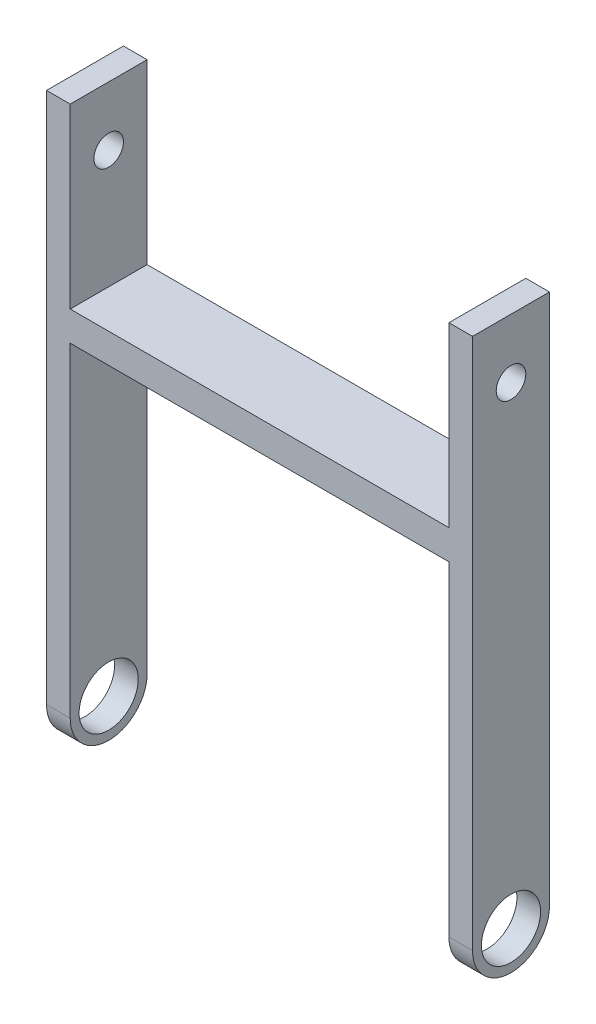
ISO-10303-21;
HEADER;
FILE_DESCRIPTION(('STEP AP214'),'2;1');
FILE_NAME('part.step','',(''),(''),'','','');
FILE_SCHEMA(('AUTOMOTIVE_DESIGN { 1 0 10303 214 1 1 1 1 }'));
ENDSEC;
DATA;
#1=APPLICATION_CONTEXT('core data for automotive mechanical design processes');
#2=APPLICATION_PROTOCOL_DEFINITION('international standard','automotive_design',2000,#1);
#3=PRODUCT_CONTEXT('',#1,'mechanical');
#4=PRODUCT('Part','Part','',(#3));
#5=PRODUCT_RELATED_PRODUCT_CATEGORY('part','',(#4));
#6=PRODUCT_DEFINITION_FORMATION('','',#4);
#7=PRODUCT_DEFINITION_CONTEXT('part definition',#1,'design');
#8=PRODUCT_DEFINITION('design','',#6,#7);
#9=PRODUCT_DEFINITION_SHAPE('','',#8);
#10=(LENGTH_UNIT() NAMED_UNIT(*) SI_UNIT(.MILLI.,.METRE.));
#11=(NAMED_UNIT(*) PLANE_ANGLE_UNIT() SI_UNIT($,.RADIAN.));
#12=(NAMED_UNIT(*) SI_UNIT($,.STERADIAN.) SOLID_ANGLE_UNIT());
#13=UNCERTAINTY_MEASURE_WITH_UNIT(LENGTH_MEASURE(1.E-05),#10,'distance_accuracy_value','');
#14=(GEOMETRIC_REPRESENTATION_CONTEXT(3) GLOBAL_UNCERTAINTY_ASSIGNED_CONTEXT((#13)) GLOBAL_UNIT_ASSIGNED_CONTEXT((#10,
#11,#12)) REPRESENTATION_CONTEXT('',''));
#15=CARTESIAN_POINT('',(0.,0.,0.));
#16=DIRECTION('',(0.,0.,1.));
#17=DIRECTION('',(1.,0.,0.));
#18=AXIS2_PLACEMENT_3D('',#15,#16,#17);
#19=CARTESIAN_POINT('',(3.99999999999999,65.,13.));
#20=DIRECTION('',(-1.,0.,0.));
#21=DIRECTION('',(0.,-1.,0.));
#22=AXIS2_PLACEMENT_3D('',#19,#20,#21);
#23=PLANE('',#22);
#24=CARTESIAN_POINT('',(4.,10.1,6.5));
#25=DIRECTION('',(-1.,0.,0.));
#26=DIRECTION('',(0.,-1.,0.));
#27=AXIS2_PLACEMENT_3D('',#24,#25,#26);
#28=CIRCLE('',#27,5.);
#29=CARTESIAN_POINT('',(4.,5.10000000000001,6.5));
#30=VERTEX_POINT('',#29);
#31=EDGE_CURVE('E195',#30,#30,#28,.T.);
#32=ORIENTED_EDGE('',*,*,#31,.T.);
#33=EDGE_LOOP('',(#32));
#34=FACE_BOUND('',#33,.T.);
#35=DIRECTION('',(0.,1.,0.));
#36=VECTOR('',#35,1.);
#37=CARTESIAN_POINT('',(3.99999999999999,65.,13.));
#38=LINE('',#37,#36);
#39=CARTESIAN_POINT('',(4.,10.1,13.));
#40=VERTEX_POINT('',#39);
#41=CARTESIAN_POINT('',(3.99999999999999,65.,13.));
#42=VERTEX_POINT('',#41);
#43=EDGE_CURVE('E162',#40,#42,#38,.T.);
#44=ORIENTED_EDGE('',*,*,#43,.F.);
#45=CARTESIAN_POINT('',(3.99999999999999,10.1,6.5));
#46=DIRECTION('',(-1.,0.,0.));
#47=DIRECTION('',(0.,-1.,0.));
#48=AXIS2_PLACEMENT_3D('',#45,#46,#47);
#49=CIRCLE('',#48,6.5);
#50=CARTESIAN_POINT('',(4.,10.1,0.));
#51=VERTEX_POINT('',#50);
#52=EDGE_CURVE('E237',#40,#51,#49,.F.);
#53=ORIENTED_EDGE('',*,*,#52,.T.);
#54=DIRECTION('',(0.,1.,0.));
#55=VECTOR('',#54,1.);
#56=CARTESIAN_POINT('',(3.99999999999999,65.,0.));
#57=LINE('',#56,#55);
#58=CARTESIAN_POINT('',(3.99999999999999,65.,0.));
#59=VERTEX_POINT('',#58);
#60=EDGE_CURVE('E194',#51,#59,#57,.T.);
#61=ORIENTED_EDGE('',*,*,#60,.T.);
#62=DIRECTION('',(0.,0.,-1.));
#63=VECTOR('',#62,1.);
#64=CARTESIAN_POINT('',(3.99999999999999,65.,13.));
#65=LINE('',#64,#63);
#66=EDGE_CURVE('E44',#42,#59,#65,.T.);
#67=ORIENTED_EDGE('',*,*,#66,.F.);
#68=EDGE_LOOP('',(#44,#53,#61,#67));
#69=FACE_BOUND('',#68,.T.);
#70=ADVANCED_FACE('F37',(#34,#69),#23,.F.);
#71=CARTESIAN_POINT('',(68.,65.,13.));
#72=DIRECTION('',(0.,1.,0.));
#73=DIRECTION('',(-1.,0.,0.));
#74=AXIS2_PLACEMENT_3D('',#71,#72,#73);
#75=PLANE('',#74);
#76=DIRECTION('',(1.,0.,0.));
#77=VECTOR('',#76,1.);
#78=CARTESIAN_POINT('',(68.,65.,0.));
#79=LINE('',#78,#77);
#80=CARTESIAN_POINT('',(68.,65.,0.));
#81=VERTEX_POINT('',#80);
#82=EDGE_CURVE('E148',#59,#81,#79,.T.);
#83=ORIENTED_EDGE('',*,*,#82,.T.);
#84=DIRECTION('',(0.,0.,-1.));
#85=VECTOR('',#84,1.);
#86=CARTESIAN_POINT('',(68.,65.,13.));
#87=LINE('',#86,#85);
#88=CARTESIAN_POINT('',(68.,65.,13.));
#89=VERTEX_POINT('',#88);
#90=EDGE_CURVE('E181',#89,#81,#87,.T.);
#91=ORIENTED_EDGE('',*,*,#90,.F.);
#92=DIRECTION('',(1.,0.,0.));
#93=VECTOR('',#92,1.);
#94=CARTESIAN_POINT('',(68.,65.,13.));
#95=LINE('',#94,#93);
#96=EDGE_CURVE('E190',#42,#89,#95,.T.);
#97=ORIENTED_EDGE('',*,*,#96,.F.);
#98=ORIENTED_EDGE('',*,*,#66,.T.);
#99=EDGE_LOOP('',(#83,#91,#97,#98));
#100=FACE_BOUND('',#99,.T.);
#101=ADVANCED_FACE('F188',(#100),#75,.F.);
#102=CARTESIAN_POINT('',(68.,0.,13.));
#103=DIRECTION('',(1.,0.,0.));
#104=DIRECTION('',(0.,0.,-1.));
#105=AXIS2_PLACEMENT_3D('',#102,#103,#104);
#106=PLANE('',#105);
#107=CARTESIAN_POINT('',(68.,10.1,6.5));
#108=DIRECTION('',(1.,0.,0.));
#109=DIRECTION('',(0.,0.,-1.));
#110=AXIS2_PLACEMENT_3D('',#107,#108,#109);
#111=CIRCLE('',#110,5.);
#112=CARTESIAN_POINT('',(68.,10.1,1.5));
#113=VERTEX_POINT('',#112);
#114=EDGE_CURVE('E218',#113,#113,#111,.T.);
#115=ORIENTED_EDGE('',*,*,#114,.T.);
#116=EDGE_LOOP('',(#115));
#117=FACE_BOUND('',#116,.T.);
#118=DIRECTION('',(0.,-1.,0.));
#119=VECTOR('',#118,1.);
#120=CARTESIAN_POINT('',(68.,0.,0.));
#121=LINE('',#120,#119);
#122=CARTESIAN_POINT('',(68.,10.1,0.));
#123=VERTEX_POINT('',#122);
#124=EDGE_CURVE('E144',#81,#123,#121,.T.);
#125=ORIENTED_EDGE('',*,*,#124,.T.);
#126=CARTESIAN_POINT('',(68.,10.1,6.5));
#127=DIRECTION('',(1.,0.,0.));
#128=DIRECTION('',(0.,0.,-1.));
#129=AXIS2_PLACEMENT_3D('',#126,#127,#128);
#130=CIRCLE('',#129,6.5);
#131=CARTESIAN_POINT('',(68.,10.1,13.));
#132=VERTEX_POINT('',#131);
#133=EDGE_CURVE('E51',#123,#132,#130,.F.);
#134=ORIENTED_EDGE('',*,*,#133,.T.);
#135=DIRECTION('',(0.,-1.,0.));
#136=VECTOR('',#135,1.);
#137=CARTESIAN_POINT('',(68.,0.,13.));
#138=LINE('',#137,#136);
#139=EDGE_CURVE('E211',#89,#132,#138,.T.);
#140=ORIENTED_EDGE('',*,*,#139,.F.);
#141=ORIENTED_EDGE('',*,*,#90,.T.);
#142=EDGE_LOOP('',(#125,#134,#140,#141));
#143=FACE_BOUND('',#142,.T.);
#144=ADVANCED_FACE('F263',(#117,#143),#106,.F.);
#145=CARTESIAN_POINT('',(72.,100.,13.));
#146=DIRECTION('',(-1.,0.,0.));
#147=DIRECTION('',(0.,-1.,0.));
#148=AXIS2_PLACEMENT_3D('',#145,#146,#147);
#149=PLANE('',#148);
#150=CARTESIAN_POINT('',(72.,90.,6.5));
#151=DIRECTION('',(-1.,0.,0.));
#152=DIRECTION('',(0.,0.,1.));
#153=AXIS2_PLACEMENT_3D('',#150,#151,#152);
#154=CIRCLE('',#153,2.5);
#155=CARTESIAN_POINT('',(72.,90.,9.));
#156=VERTEX_POINT('',#155);
#157=EDGE_CURVE('E233',#156,#156,#154,.T.);
#158=ORIENTED_EDGE('',*,*,#157,.T.);
#159=EDGE_LOOP('',(#158));
#160=FACE_BOUND('',#159,.T.);
#161=CARTESIAN_POINT('',(72.,10.1,6.5));
#162=DIRECTION('',(1.,0.,0.));
#163=DIRECTION('',(0.,1.,0.));
#164=AXIS2_PLACEMENT_3D('',#161,#162,#163);
#165=CIRCLE('',#164,5.);
#166=CARTESIAN_POINT('',(72.,15.1,6.5));
#167=VERTEX_POINT('',#166);
#168=EDGE_CURVE('E222',#167,#167,#165,.T.);
#169=ORIENTED_EDGE('',*,*,#168,.F.);
#170=EDGE_LOOP('',(#169));
#171=FACE_BOUND('',#170,.T.);
#172=DIRECTION('',(0.,1.,0.));
#173=VECTOR('',#172,1.);
#174=CARTESIAN_POINT('',(72.,100.,13.));
#175=LINE('',#174,#173);
#176=CARTESIAN_POINT('',(72.,10.1,13.));
#177=VERTEX_POINT('',#176);
#178=CARTESIAN_POINT('',(72.,100.,13.));
#179=VERTEX_POINT('',#178);
#180=EDGE_CURVE('E138',#177,#179,#175,.T.);
#181=ORIENTED_EDGE('',*,*,#180,.F.);
#182=CARTESIAN_POINT('',(72.,10.1,6.5));
#183=DIRECTION('',(1.,0.,0.));
#184=DIRECTION('',(0.,0.,1.));
#185=AXIS2_PLACEMENT_3D('',#182,#183,#184);
#186=CIRCLE('',#185,6.5);
#187=CARTESIAN_POINT('',(72.,10.1,0.));
#188=VERTEX_POINT('',#187);
#189=EDGE_CURVE('E124',#177,#188,#186,.T.);
#190=ORIENTED_EDGE('',*,*,#189,.T.);
#191=DIRECTION('',(0.,1.,0.));
#192=VECTOR('',#191,1.);
#193=CARTESIAN_POINT('',(72.,100.,0.));
#194=LINE('',#193,#192);
#195=CARTESIAN_POINT('',(72.,100.,0.));
#196=VERTEX_POINT('',#195);
#197=EDGE_CURVE('E136',#188,#196,#194,.T.);
#198=ORIENTED_EDGE('',*,*,#197,.T.);
#199=DIRECTION('',(0.,0.,-1.));
#200=VECTOR('',#199,1.);
#201=CARTESIAN_POINT('',(72.,100.,13.));
#202=LINE('',#201,#200);
#203=EDGE_CURVE('E179',#179,#196,#202,.T.);
#204=ORIENTED_EDGE('',*,*,#203,.F.);
#205=EDGE_LOOP('',(#181,#190,#198,#204));
#206=FACE_BOUND('',#205,.T.);
#207=ADVANCED_FACE('F134',(#160,#171,#206),#149,.F.);
#208=CARTESIAN_POINT('',(68.,100.,13.));
#209=DIRECTION('',(0.,-1.,0.));
#210=DIRECTION('',(0.,0.,-1.));
#211=AXIS2_PLACEMENT_3D('',#208,#209,#210);
#212=PLANE('',#211);
#213=DIRECTION('',(-1.,0.,0.));
#214=VECTOR('',#213,1.);
#215=CARTESIAN_POINT('',(68.,100.,0.));
#216=LINE('',#215,#214);
#217=CARTESIAN_POINT('',(68.,100.,0.));
#218=VERTEX_POINT('',#217);
#219=EDGE_CURVE('E143',#196,#218,#216,.T.);
#220=ORIENTED_EDGE('',*,*,#219,.T.);
#221=DIRECTION('',(0.,0.,-1.));
#222=VECTOR('',#221,1.);
#223=CARTESIAN_POINT('',(68.,100.,13.));
#224=LINE('',#223,#222);
#225=CARTESIAN_POINT('',(68.,100.,13.));
#226=VERTEX_POINT('',#225);
#227=EDGE_CURVE('E176',#226,#218,#224,.T.);
#228=ORIENTED_EDGE('',*,*,#227,.F.);
#229=DIRECTION('',(-1.,0.,0.));
#230=VECTOR('',#229,1.);
#231=CARTESIAN_POINT('',(68.,100.,13.));
#232=LINE('',#231,#230);
#233=EDGE_CURVE('E208',#179,#226,#232,.T.);
#234=ORIENTED_EDGE('',*,*,#233,.F.);
#235=ORIENTED_EDGE('',*,*,#203,.T.);
#236=EDGE_LOOP('',(#220,#228,#234,#235));
#237=FACE_BOUND('',#236,.T.);
#238=ADVANCED_FACE('F271',(#237),#212,.F.);
#239=CARTESIAN_POINT('',(68.,70.,13.));
#240=DIRECTION('',(1.,0.,0.));
#241=DIRECTION('',(0.,0.,-1.));
#242=AXIS2_PLACEMENT_3D('',#239,#240,#241);
#243=PLANE('',#242);
#244=CARTESIAN_POINT('',(68.,90.,6.5));
#245=DIRECTION('',(1.,0.,0.));
#246=DIRECTION('',(0.,0.,-1.));
#247=AXIS2_PLACEMENT_3D('',#244,#245,#246);
#248=CIRCLE('',#247,2.5);
#249=CARTESIAN_POINT('',(68.,90.,4.));
#250=VERTEX_POINT('',#249);
#251=EDGE_CURVE('E225',#250,#250,#248,.T.);
#252=ORIENTED_EDGE('',*,*,#251,.T.);
#253=EDGE_LOOP('',(#252));
#254=FACE_BOUND('',#253,.T.);
#255=DIRECTION('',(0.,-1.,0.));
#256=VECTOR('',#255,1.);
#257=CARTESIAN_POINT('',(68.,70.,0.));
#258=LINE('',#257,#256);
#259=CARTESIAN_POINT('',(68.,70.,0.));
#260=VERTEX_POINT('',#259);
#261=EDGE_CURVE('E146',#218,#260,#258,.T.);
#262=ORIENTED_EDGE('',*,*,#261,.T.);
#263=DIRECTION('',(0.,0.,-1.));
#264=VECTOR('',#263,1.);
#265=CARTESIAN_POINT('',(68.,70.,13.));
#266=LINE('',#265,#264);
#267=CARTESIAN_POINT('',(68.,70.,13.));
#268=VERTEX_POINT('',#267);
#269=EDGE_CURVE('E173',#268,#260,#266,.T.);
#270=ORIENTED_EDGE('',*,*,#269,.F.);
#271=DIRECTION('',(0.,-1.,0.));
#272=VECTOR('',#271,1.);
#273=CARTESIAN_POINT('',(68.,70.,13.));
#274=LINE('',#273,#272);
#275=EDGE_CURVE('E206',#226,#268,#274,.T.);
#276=ORIENTED_EDGE('',*,*,#275,.F.);
#277=ORIENTED_EDGE('',*,*,#227,.T.);
#278=EDGE_LOOP('',(#262,#270,#276,#277));
#279=FACE_BOUND('',#278,.T.);
#280=ADVANCED_FACE('F311',(#254,#279),#243,.F.);
#281=CARTESIAN_POINT('',(4.,70.,13.));
#282=DIRECTION('',(0.,-1.,0.));
#283=DIRECTION('',(0.,0.,-1.));
#284=AXIS2_PLACEMENT_3D('',#281,#282,#283);
#285=PLANE('',#284);
#286=DIRECTION('',(-1.,0.,0.));
#287=VECTOR('',#286,1.);
#288=CARTESIAN_POINT('',(4.,70.,0.));
#289=LINE('',#288,#287);
#290=CARTESIAN_POINT('',(4.,70.,0.));
#291=VERTEX_POINT('',#290);
#292=EDGE_CURVE('E153',#260,#291,#289,.T.);
#293=ORIENTED_EDGE('',*,*,#292,.T.);
#294=DIRECTION('',(0.,0.,-1.));
#295=VECTOR('',#294,1.);
#296=CARTESIAN_POINT('',(4.,70.,13.));
#297=LINE('',#296,#295);
#298=CARTESIAN_POINT('',(4.,70.,13.));
#299=VERTEX_POINT('',#298);
#300=EDGE_CURVE('E170',#299,#291,#297,.T.);
#301=ORIENTED_EDGE('',*,*,#300,.F.);
#302=DIRECTION('',(-1.,0.,0.));
#303=VECTOR('',#302,1.);
#304=CARTESIAN_POINT('',(4.,70.,13.));
#305=LINE('',#304,#303);
#306=EDGE_CURVE('E204',#268,#299,#305,.T.);
#307=ORIENTED_EDGE('',*,*,#306,.F.);
#308=ORIENTED_EDGE('',*,*,#269,.T.);
#309=EDGE_LOOP('',(#293,#301,#307,#308));
#310=FACE_BOUND('',#309,.T.);
#311=ADVANCED_FACE('F307',(#310),#285,.F.);
#312=CARTESIAN_POINT('',(4.,100.,13.));
#313=DIRECTION('',(-1.,0.,0.));
#314=DIRECTION('',(0.,0.,1.));
#315=AXIS2_PLACEMENT_3D('',#312,#313,#314);
#316=PLANE('',#315);
#317=CARTESIAN_POINT('',(4.,90.,6.5));
#318=DIRECTION('',(-1.,0.,0.));
#319=DIRECTION('',(0.,0.,1.));
#320=AXIS2_PLACEMENT_3D('',#317,#318,#319);
#321=CIRCLE('',#320,2.5);
#322=CARTESIAN_POINT('',(4.,90.,9.));
#323=VERTEX_POINT('',#322);
#324=EDGE_CURVE('E230',#323,#323,#321,.T.);
#325=ORIENTED_EDGE('',*,*,#324,.T.);
#326=EDGE_LOOP('',(#325));
#327=FACE_BOUND('',#326,.T.);
#328=DIRECTION('',(0.,1.,0.));
#329=VECTOR('',#328,1.);
#330=CARTESIAN_POINT('',(4.,100.,0.));
#331=LINE('',#330,#329);
#332=CARTESIAN_POINT('',(4.,100.,0.));
#333=VERTEX_POINT('',#332);
#334=EDGE_CURVE('E155',#291,#333,#331,.T.);
#335=ORIENTED_EDGE('',*,*,#334,.T.);
#336=DIRECTION('',(0.,0.,-1.));
#337=VECTOR('',#336,1.);
#338=CARTESIAN_POINT('',(4.,100.,13.));
#339=LINE('',#338,#337);
#340=CARTESIAN_POINT('',(4.,100.,13.));
#341=VERTEX_POINT('',#340);
#342=EDGE_CURVE('E166',#341,#333,#339,.T.);
#343=ORIENTED_EDGE('',*,*,#342,.F.);
#344=DIRECTION('',(0.,1.,0.));
#345=VECTOR('',#344,1.);
#346=CARTESIAN_POINT('',(4.,100.,13.));
#347=LINE('',#346,#345);
#348=EDGE_CURVE('E202',#299,#341,#347,.T.);
#349=ORIENTED_EDGE('',*,*,#348,.F.);
#350=ORIENTED_EDGE('',*,*,#300,.T.);
#351=EDGE_LOOP('',(#335,#343,#349,#350));
#352=FACE_BOUND('',#351,.T.);
#353=ADVANCED_FACE('F304',(#327,#352),#316,.F.);
#354=CARTESIAN_POINT('',(0.,100.,13.));
#355=DIRECTION('',(0.,-1.,0.));
#356=DIRECTION('',(0.,0.,-1.));
#357=AXIS2_PLACEMENT_3D('',#354,#355,#356);
#358=PLANE('',#357);
#359=DIRECTION('',(-1.,0.,0.));
#360=VECTOR('',#359,1.);
#361=CARTESIAN_POINT('',(0.,100.,0.));
#362=LINE('',#361,#360);
#363=CARTESIAN_POINT('',(0.,100.,0.));
#364=VERTEX_POINT('',#363);
#365=EDGE_CURVE('E157',#333,#364,#362,.T.);
#366=ORIENTED_EDGE('',*,*,#365,.T.);
#367=DIRECTION('',(0.,0.,-1.));
#368=VECTOR('',#367,1.);
#369=CARTESIAN_POINT('',(0.,100.,13.));
#370=LINE('',#369,#368);
#371=CARTESIAN_POINT('',(0.,100.,13.));
#372=VERTEX_POINT('',#371);
#373=EDGE_CURVE('E163',#372,#364,#370,.T.);
#374=ORIENTED_EDGE('',*,*,#373,.F.);
#375=DIRECTION('',(-1.,0.,0.));
#376=VECTOR('',#375,1.);
#377=CARTESIAN_POINT('',(0.,100.,13.));
#378=LINE('',#377,#376);
#379=EDGE_CURVE('E200',#341,#372,#378,.T.);
#380=ORIENTED_EDGE('',*,*,#379,.F.);
#381=ORIENTED_EDGE('',*,*,#342,.T.);
#382=EDGE_LOOP('',(#366,#374,#380,#381));
#383=FACE_BOUND('',#382,.T.);
#384=ADVANCED_FACE('F258',(#383),#358,.F.);
#385=CARTESIAN_POINT('',(0.,0.,13.));
#386=DIRECTION('',(1.,0.,0.));
#387=DIRECTION('',(0.,0.,-1.));
#388=AXIS2_PLACEMENT_3D('',#385,#386,#387);
#389=PLANE('',#388);
#390=CARTESIAN_POINT('',(0.,90.,6.5));
#391=DIRECTION('',(-1.,0.,0.));
#392=DIRECTION('',(0.,0.,1.));
#393=AXIS2_PLACEMENT_3D('',#390,#391,#392);
#394=CIRCLE('',#393,2.5);
#395=CARTESIAN_POINT('',(0.,90.,9.));
#396=VERTEX_POINT('',#395);
#397=EDGE_CURVE('E234',#396,#396,#394,.T.);
#398=ORIENTED_EDGE('',*,*,#397,.F.);
#399=EDGE_LOOP('',(#398));
#400=FACE_BOUND('',#399,.T.);
#401=CARTESIAN_POINT('',(0.,10.1,6.5));
#402=DIRECTION('',(1.,0.,0.));
#403=DIRECTION('',(0.,1.,0.));
#404=AXIS2_PLACEMENT_3D('',#401,#402,#403);
#405=CIRCLE('',#404,5.);
#406=CARTESIAN_POINT('',(0.,15.1,6.5));
#407=VERTEX_POINT('',#406);
#408=EDGE_CURVE('E221',#407,#407,#405,.T.);
#409=ORIENTED_EDGE('',*,*,#408,.T.);
#410=EDGE_LOOP('',(#409));
#411=FACE_BOUND('',#410,.T.);
#412=DIRECTION('',(0.,-1.,0.));
#413=VECTOR('',#412,1.);
#414=CARTESIAN_POINT('',(0.,0.,0.));
#415=LINE('',#414,#413);
#416=CARTESIAN_POINT('',(0.,10.1,0.));
#417=VERTEX_POINT('',#416);
#418=EDGE_CURVE('E159',#364,#417,#415,.T.);
#419=ORIENTED_EDGE('',*,*,#418,.T.);
#420=CARTESIAN_POINT('',(0.,10.1,6.5));
#421=DIRECTION('',(1.,0.,0.));
#422=DIRECTION('',(0.,0.,1.));
#423=AXIS2_PLACEMENT_3D('',#420,#421,#422);
#424=CIRCLE('',#423,6.5);
#425=CARTESIAN_POINT('',(0.,10.1,13.));
#426=VERTEX_POINT('',#425);
#427=EDGE_CURVE('E58',#426,#417,#424,.T.);
#428=ORIENTED_EDGE('',*,*,#427,.F.);
#429=DIRECTION('',(0.,-1.,0.));
#430=VECTOR('',#429,1.);
#431=CARTESIAN_POINT('',(0.,0.,13.));
#432=LINE('',#431,#430);
#433=EDGE_CURVE('E167',#372,#426,#432,.T.);
#434=ORIENTED_EDGE('',*,*,#433,.F.);
#435=ORIENTED_EDGE('',*,*,#373,.T.);
#436=EDGE_LOOP('',(#419,#428,#434,#435));
#437=FACE_BOUND('',#436,.T.);
#438=ADVANCED_FACE('F250',(#400,#411,#437),#389,.F.);
#439=CARTESIAN_POINT('',(0.,0.,13.));
#440=DIRECTION('',(0.,0.,-1.));
#441=DIRECTION('',(-1.,0.,0.));
#442=AXIS2_PLACEMENT_3D('',#439,#440,#441);
#443=PLANE('',#442);
#444=ORIENTED_EDGE('',*,*,#433,.T.);
#445=DIRECTION('',(-1.,0.,0.));
#446=VECTOR('',#445,1.);
#447=CARTESIAN_POINT('',(72.,10.1,13.));
#448=LINE('',#447,#446);
#449=EDGE_CURVE('E130',#40,#426,#448,.T.);
#450=ORIENTED_EDGE('',*,*,#449,.F.);
#451=ORIENTED_EDGE('',*,*,#43,.T.);
#452=ORIENTED_EDGE('',*,*,#96,.T.);
#453=ORIENTED_EDGE('',*,*,#139,.T.);
#454=EDGE_CURVE('E242',#177,#132,#448,.T.);
#455=ORIENTED_EDGE('',*,*,#454,.F.);
#456=ORIENTED_EDGE('',*,*,#180,.T.);
#457=ORIENTED_EDGE('',*,*,#233,.T.);
#458=ORIENTED_EDGE('',*,*,#275,.T.);
#459=ORIENTED_EDGE('',*,*,#306,.T.);
#460=ORIENTED_EDGE('',*,*,#348,.T.);
#461=ORIENTED_EDGE('',*,*,#379,.T.);
#462=EDGE_LOOP('',(#444,#450,#451,#452,#453,#455,#456,#457,#458,#459,#460,#461));
#463=FACE_BOUND('',#462,.T.);
#464=ADVANCED_FACE('F252',(#463),#443,.F.);
#465=CARTESIAN_POINT('',(0.,0.,0.));
#466=DIRECTION('',(0.,0.,-1.));
#467=DIRECTION('',(-1.,0.,0.));
#468=AXIS2_PLACEMENT_3D('',#465,#466,#467);
#469=PLANE('',#468);
#470=DIRECTION('',(-1.,0.,0.));
#471=VECTOR('',#470,1.);
#472=CARTESIAN_POINT('',(72.,10.1,0.));
#473=LINE('',#472,#471);
#474=EDGE_CURVE('E11',#417,#51,#473,.F.);
#475=ORIENTED_EDGE('',*,*,#474,.F.);
#476=ORIENTED_EDGE('',*,*,#418,.F.);
#477=ORIENTED_EDGE('',*,*,#365,.F.);
#478=ORIENTED_EDGE('',*,*,#334,.F.);
#479=ORIENTED_EDGE('',*,*,#292,.F.);
#480=ORIENTED_EDGE('',*,*,#261,.F.);
#481=ORIENTED_EDGE('',*,*,#219,.F.);
#482=ORIENTED_EDGE('',*,*,#197,.F.);
#483=DIRECTION('',(-1.,0.,0.));
#484=VECTOR('',#483,1.);
#485=CARTESIAN_POINT('',(72.,10.1,0.));
#486=LINE('',#485,#484);
#487=EDGE_CURVE('E121',#188,#123,#486,.T.);
#488=ORIENTED_EDGE('',*,*,#487,.T.);
#489=ORIENTED_EDGE('',*,*,#124,.F.);
#490=ORIENTED_EDGE('',*,*,#82,.F.);
#491=ORIENTED_EDGE('',*,*,#60,.F.);
#492=EDGE_LOOP('',(#475,#476,#477,#478,#479,#480,#481,#482,#488,#489,#490,#491));
#493=FACE_BOUND('',#492,.T.);
#494=ADVANCED_FACE('F141',(#493),#469,.T.);
#495=CARTESIAN_POINT('',(0.,10.1,6.5));
#496=DIRECTION('',(1.,0.,0.));
#497=DIRECTION('',(0.,1.,0.));
#498=AXIS2_PLACEMENT_3D('',#495,#496,#497);
#499=CYLINDRICAL_SURFACE('',#498,5.);
#500=ORIENTED_EDGE('',*,*,#408,.F.);
#501=EDGE_LOOP('',(#500));
#502=FACE_BOUND('',#501,.T.);
#503=ORIENTED_EDGE('',*,*,#31,.F.);
#504=EDGE_LOOP('',(#503));
#505=FACE_BOUND('',#504,.T.);
#506=ADVANCED_FACE('F280',(#502,#505),#499,.F.);
#507=ORIENTED_EDGE('',*,*,#168,.T.);
#508=EDGE_LOOP('',(#507));
#509=FACE_BOUND('',#508,.T.);
#510=ORIENTED_EDGE('',*,*,#114,.F.);
#511=EDGE_LOOP('',(#510));
#512=FACE_BOUND('',#511,.T.);
#513=ADVANCED_FACE('F282',(#509,#512),#499,.F.);
#514=CARTESIAN_POINT('',(72.,90.,6.5));
#515=DIRECTION('',(-1.,0.,0.));
#516=DIRECTION('',(0.,0.,1.));
#517=AXIS2_PLACEMENT_3D('',#514,#515,#516);
#518=CYLINDRICAL_SURFACE('',#517,2.5);
#519=ORIENTED_EDGE('',*,*,#397,.T.);
#520=EDGE_LOOP('',(#519));
#521=FACE_BOUND('',#520,.T.);
#522=ORIENTED_EDGE('',*,*,#324,.F.);
#523=EDGE_LOOP('',(#522));
#524=FACE_BOUND('',#523,.T.);
#525=ADVANCED_FACE('F289',(#521,#524),#518,.F.);
#526=ORIENTED_EDGE('',*,*,#157,.F.);
#527=EDGE_LOOP('',(#526));
#528=FACE_BOUND('',#527,.T.);
#529=ORIENTED_EDGE('',*,*,#251,.F.);
#530=EDGE_LOOP('',(#529));
#531=FACE_BOUND('',#530,.T.);
#532=ADVANCED_FACE('F295',(#528,#531),#518,.F.);
#533=CARTESIAN_POINT('',(72.,10.1,6.5));
#534=DIRECTION('',(-1.,0.,0.));
#535=DIRECTION('',(0.,0.,1.));
#536=AXIS2_PLACEMENT_3D('',#533,#534,#535);
#537=CYLINDRICAL_SURFACE('',#536,6.5);
#538=ORIENTED_EDGE('',*,*,#487,.F.);
#539=ORIENTED_EDGE('',*,*,#189,.F.);
#540=ORIENTED_EDGE('',*,*,#454,.T.);
#541=ORIENTED_EDGE('',*,*,#133,.F.);
#542=EDGE_LOOP('',(#538,#539,#540,#541));
#543=FACE_BOUND('',#542,.T.);
#544=ADVANCED_FACE('F123',(#543),#537,.T.);
#545=ORIENTED_EDGE('',*,*,#449,.T.);
#546=ORIENTED_EDGE('',*,*,#427,.T.);
#547=ORIENTED_EDGE('',*,*,#474,.T.);
#548=ORIENTED_EDGE('',*,*,#52,.F.);
#549=EDGE_LOOP('',(#545,#546,#547,#548));
#550=FACE_BOUND('',#549,.T.);
#551=ADVANCED_FACE('F246',(#550),#537,.T.);
#552=CLOSED_SHELL('',(#70,#101,#144,#207,#238,#280,#311,#353,#384,#438,#464,#494,#506,#513,#525,
#532,#544,#551));
#553=MANIFOLD_SOLID_BREP('B2',#552);
#554=ADVANCED_BREP_SHAPE_REPRESENTATION('',(#18,#553),#14);
#555=SHAPE_DEFINITION_REPRESENTATION(#9,#554);
ENDSEC;
END-ISO-10303-21;
